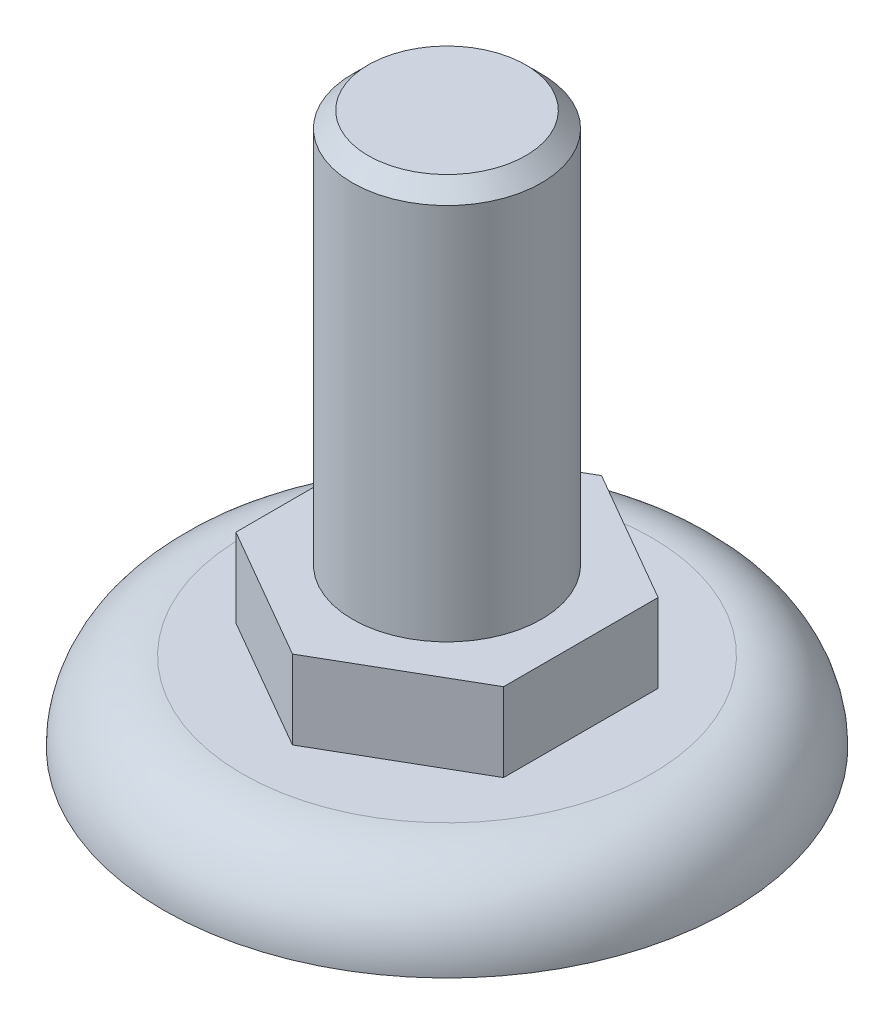
ISO-10303-21;
HEADER;
FILE_DESCRIPTION(('STEP AP214'),'2;1');
FILE_NAME('part.step','',(''),(''),'','','');
FILE_SCHEMA(('AUTOMOTIVE_DESIGN { 1 0 10303 214 1 1 1 1 }'));
ENDSEC;
DATA;
#1=APPLICATION_CONTEXT('core data for automotive mechanical design processes');
#2=APPLICATION_PROTOCOL_DEFINITION('international standard','automotive_design',2000,#1);
#3=PRODUCT_CONTEXT('',#1,'mechanical');
#4=PRODUCT('Part','Part','',(#3));
#5=PRODUCT_RELATED_PRODUCT_CATEGORY('part','',(#4));
#6=PRODUCT_DEFINITION_FORMATION('','',#4);
#7=PRODUCT_DEFINITION_CONTEXT('part definition',#1,'design');
#8=PRODUCT_DEFINITION('design','',#6,#7);
#9=PRODUCT_DEFINITION_SHAPE('','',#8);
#10=(LENGTH_UNIT() NAMED_UNIT(*) SI_UNIT(.MILLI.,.METRE.));
#11=(NAMED_UNIT(*) PLANE_ANGLE_UNIT() SI_UNIT($,.RADIAN.));
#12=(NAMED_UNIT(*) SI_UNIT($,.STERADIAN.) SOLID_ANGLE_UNIT());
#13=UNCERTAINTY_MEASURE_WITH_UNIT(LENGTH_MEASURE(1.E-05),#10,'distance_accuracy_value','');
#14=(GEOMETRIC_REPRESENTATION_CONTEXT(3) GLOBAL_UNCERTAINTY_ASSIGNED_CONTEXT((#13)) GLOBAL_UNIT_ASSIGNED_CONTEXT((#10,
#11,#12)) REPRESENTATION_CONTEXT('',''));
#15=CARTESIAN_POINT('',(0.,0.,0.));
#16=DIRECTION('',(0.,0.,1.));
#17=DIRECTION('',(1.,0.,0.));
#18=AXIS2_PLACEMENT_3D('',#15,#16,#17);
#19=CARTESIAN_POINT('',(-20.,70.,0.));
#20=DIRECTION('',(0.,-1.,0.));
#21=DIRECTION('',(0.,0.,-1.));
#22=AXIS2_PLACEMENT_3D('',#19,#20,#21);
#23=CYLINDRICAL_SURFACE('',#22,6.);
#24=CARTESIAN_POINT('',(-20.,69.,0.));
#25=DIRECTION('',(0.,1.,0.));
#26=DIRECTION('',(0.,0.,1.));
#27=AXIS2_PLACEMENT_3D('',#24,#25,#26);
#28=CIRCLE('',#27,6.);
#29=CARTESIAN_POINT('',(-20.,69.,6.));
#30=VERTEX_POINT('',#29);
#31=EDGE_CURVE('E25',#30,#30,#28,.F.);
#32=ORIENTED_EDGE('',*,*,#31,.T.);
#33=EDGE_LOOP('',(#32));
#34=FACE_BOUND('',#33,.T.);
#35=CARTESIAN_POINT('',(-20.,45.,0.));
#36=DIRECTION('',(0.,1.,0.));
#37=DIRECTION('',(0.,0.,1.));
#38=AXIS2_PLACEMENT_3D('',#35,#36,#37);
#39=CIRCLE('',#38,6.);
#40=CARTESIAN_POINT('',(-20.,45.,6.));
#41=VERTEX_POINT('',#40);
#42=EDGE_CURVE('E102',#41,#41,#39,.T.);
#43=ORIENTED_EDGE('',*,*,#42,.T.);
#44=EDGE_LOOP('',(#43));
#45=FACE_BOUND('',#44,.T.);
#46=ADVANCED_FACE('F15',(#34,#45),#23,.T.);
#47=CARTESIAN_POINT('',(-20.,70.,0.));
#48=DIRECTION('',(0.,1.,0.));
#49=DIRECTION('',(0.,0.,1.));
#50=AXIS2_PLACEMENT_3D('',#47,#48,#49);
#51=PLANE('',#50);
#52=CARTESIAN_POINT('',(-20.,70.,0.));
#53=DIRECTION('',(0.,1.,0.));
#54=DIRECTION('',(0.,0.,1.));
#55=AXIS2_PLACEMENT_3D('',#52,#53,#54);
#56=CIRCLE('',#55,5.);
#57=CARTESIAN_POINT('',(-20.,70.,5.));
#58=VERTEX_POINT('',#57);
#59=EDGE_CURVE('E105',#58,#58,#56,.T.);
#60=ORIENTED_EDGE('',*,*,#59,.T.);
#61=EDGE_LOOP('',(#60));
#62=FACE_BOUND('',#61,.T.);
#63=ADVANCED_FACE('F116',(#62),#51,.T.);
#64=CARTESIAN_POINT('',(-20.,70.,0.));
#65=DIRECTION('',(0.,-1.,0.));
#66=DIRECTION('',(0.,0.,-1.));
#67=AXIS2_PLACEMENT_3D('',#64,#65,#66);
#68=CONICAL_SURFACE('',#67,5.,0.785398163397446);
#69=ORIENTED_EDGE('',*,*,#31,.F.);
#70=EDGE_LOOP('',(#69));
#71=FACE_BOUND('',#70,.T.);
#72=ORIENTED_EDGE('',*,*,#59,.F.);
#73=EDGE_LOOP('',(#72));
#74=FACE_BOUND('',#73,.T.);
#75=ADVANCED_FACE('F17',(#71,#74),#68,.T.);
#76=CARTESIAN_POINT('',(-11.5,45.,-4.90747728811182));
#77=DIRECTION('',(-0.5,0.,0.866025403784439));
#78=DIRECTION('',(0.866025403784439,0.,0.5));
#79=AXIS2_PLACEMENT_3D('',#76,#77,#78);
#80=PLANE('',#79);
#81=DIRECTION('',(-0.866025403784439,0.,-0.5));
#82=VECTOR('',#81,1.);
#83=CARTESIAN_POINT('',(-11.5,40.,-4.90747728811182));
#84=LINE('',#83,#82);
#85=CARTESIAN_POINT('',(-11.5,40.,-4.90747728811182));
#86=VERTEX_POINT('',#85);
#87=CARTESIAN_POINT('',(-20.,40.,-9.81495457622364));
#88=VERTEX_POINT('',#87);
#89=EDGE_CURVE('E71',#86,#88,#84,.T.);
#90=ORIENTED_EDGE('',*,*,#89,.T.);
#91=DIRECTION('',(0.,-1.,0.));
#92=VECTOR('',#91,1.);
#93=CARTESIAN_POINT('',(-20.,45.,-9.81495457622364));
#94=LINE('',#93,#92);
#95=CARTESIAN_POINT('',(-20.,45.,-9.81495457622364));
#96=VERTEX_POINT('',#95);
#97=EDGE_CURVE('E99',#96,#88,#94,.T.);
#98=ORIENTED_EDGE('',*,*,#97,.F.);
#99=DIRECTION('',(-0.866025403784439,0.,-0.5));
#100=VECTOR('',#99,1.);
#101=CARTESIAN_POINT('',(-11.5,45.,-4.90747728811182));
#102=LINE('',#101,#100);
#103=CARTESIAN_POINT('',(-11.5,45.,-4.90747728811182));
#104=VERTEX_POINT('',#103);
#105=EDGE_CURVE('E75',#104,#96,#102,.T.);
#106=ORIENTED_EDGE('',*,*,#105,.F.);
#107=DIRECTION('',(0.,-1.,0.));
#108=VECTOR('',#107,1.);
#109=CARTESIAN_POINT('',(-11.5,45.,-4.90747728811182));
#110=LINE('',#109,#108);
#111=EDGE_CURVE('E88',#104,#86,#110,.T.);
#112=ORIENTED_EDGE('',*,*,#111,.T.);
#113=EDGE_LOOP('',(#90,#98,#106,#112));
#114=FACE_BOUND('',#113,.T.);
#115=ADVANCED_FACE('F115',(#114),#80,.F.);
#116=CARTESIAN_POINT('',(-20.,45.,-9.81495457622364));
#117=DIRECTION('',(0.5,0.,0.866025403784439));
#118=DIRECTION('',(0.866025403784439,0.,-0.5));
#119=AXIS2_PLACEMENT_3D('',#116,#117,#118);
#120=PLANE('',#119);
#121=DIRECTION('',(-0.866025403784439,0.,0.5));
#122=VECTOR('',#121,1.);
#123=CARTESIAN_POINT('',(-20.,40.,-9.81495457622364));
#124=LINE('',#123,#122);
#125=CARTESIAN_POINT('',(-28.5,40.,-4.90747728811182));
#126=VERTEX_POINT('',#125);
#127=EDGE_CURVE('E208',#88,#126,#124,.T.);
#128=ORIENTED_EDGE('',*,*,#127,.T.);
#129=DIRECTION('',(0.,-1.,0.));
#130=VECTOR('',#129,1.);
#131=CARTESIAN_POINT('',(-28.5,45.,-4.90747728811182));
#132=LINE('',#131,#130);
#133=CARTESIAN_POINT('',(-28.5,45.,-4.90747728811182));
#134=VERTEX_POINT('',#133);
#135=EDGE_CURVE('E96',#134,#126,#132,.T.);
#136=ORIENTED_EDGE('',*,*,#135,.F.);
#137=DIRECTION('',(-0.866025403784439,0.,0.5));
#138=VECTOR('',#137,1.);
#139=CARTESIAN_POINT('',(-20.,45.,-9.81495457622364));
#140=LINE('',#139,#138);
#141=EDGE_CURVE('E198',#96,#134,#140,.T.);
#142=ORIENTED_EDGE('',*,*,#141,.F.);
#143=ORIENTED_EDGE('',*,*,#97,.T.);
#144=EDGE_LOOP('',(#128,#136,#142,#143));
#145=FACE_BOUND('',#144,.T.);
#146=ADVANCED_FACE('F129',(#145),#120,.F.);
#147=CARTESIAN_POINT('',(-28.5,45.,-4.90747728811182));
#148=DIRECTION('',(1.,0.,0.));
#149=DIRECTION('',(0.,0.,-1.));
#150=AXIS2_PLACEMENT_3D('',#147,#148,#149);
#151=PLANE('',#150);
#152=DIRECTION('',(0.,0.,1.));
#153=VECTOR('',#152,1.);
#154=CARTESIAN_POINT('',(-28.5,40.,-4.90747728811182));
#155=LINE('',#154,#153);
#156=CARTESIAN_POINT('',(-28.5,40.,4.90747728811182));
#157=VERTEX_POINT('',#156);
#158=EDGE_CURVE('E211',#126,#157,#155,.T.);
#159=ORIENTED_EDGE('',*,*,#158,.T.);
#160=DIRECTION('',(0.,-1.,0.));
#161=VECTOR('',#160,1.);
#162=CARTESIAN_POINT('',(-28.5,45.,4.90747728811182));
#163=LINE('',#162,#161);
#164=CARTESIAN_POINT('',(-28.5,45.,4.90747728811182));
#165=VERTEX_POINT('',#164);
#166=EDGE_CURVE('E90',#165,#157,#163,.T.);
#167=ORIENTED_EDGE('',*,*,#166,.F.);
#168=DIRECTION('',(0.,0.,1.));
#169=VECTOR('',#168,1.);
#170=CARTESIAN_POINT('',(-28.5,45.,-4.90747728811182));
#171=LINE('',#170,#169);
#172=EDGE_CURVE('E200',#134,#165,#171,.T.);
#173=ORIENTED_EDGE('',*,*,#172,.F.);
#174=ORIENTED_EDGE('',*,*,#135,.T.);
#175=EDGE_LOOP('',(#159,#167,#173,#174));
#176=FACE_BOUND('',#175,.T.);
#177=ADVANCED_FACE('F133',(#176),#151,.F.);
#178=CARTESIAN_POINT('',(-28.5,45.,4.90747728811182));
#179=DIRECTION('',(0.5,0.,-0.866025403784439));
#180=DIRECTION('',(-0.866025403784439,0.,-0.5));
#181=AXIS2_PLACEMENT_3D('',#178,#179,#180);
#182=PLANE('',#181);
#183=DIRECTION('',(0.866025403784439,0.,0.5));
#184=VECTOR('',#183,1.);
#185=CARTESIAN_POINT('',(-28.5,40.,4.90747728811182));
#186=LINE('',#185,#184);
#187=CARTESIAN_POINT('',(-20.,40.,9.81495457622364));
#188=VERTEX_POINT('',#187);
#189=EDGE_CURVE('E85',#157,#188,#186,.T.);
#190=ORIENTED_EDGE('',*,*,#189,.T.);
#191=DIRECTION('',(0.,-1.,0.));
#192=VECTOR('',#191,1.);
#193=CARTESIAN_POINT('',(-20.,45.,9.81495457622364));
#194=LINE('',#193,#192);
#195=CARTESIAN_POINT('',(-20.,45.,9.81495457622364));
#196=VERTEX_POINT('',#195);
#197=EDGE_CURVE('E84',#196,#188,#194,.T.);
#198=ORIENTED_EDGE('',*,*,#197,.F.);
#199=DIRECTION('',(0.866025403784439,0.,0.5));
#200=VECTOR('',#199,1.);
#201=CARTESIAN_POINT('',(-28.5,45.,4.90747728811182));
#202=LINE('',#201,#200);
#203=EDGE_CURVE('E202',#165,#196,#202,.T.);
#204=ORIENTED_EDGE('',*,*,#203,.F.);
#205=ORIENTED_EDGE('',*,*,#166,.T.);
#206=EDGE_LOOP('',(#190,#198,#204,#205));
#207=FACE_BOUND('',#206,.T.);
#208=ADVANCED_FACE('F137',(#207),#182,.F.);
#209=CARTESIAN_POINT('',(-20.,45.,9.81495457622364));
#210=DIRECTION('',(-0.5,0.,-0.866025403784439));
#211=DIRECTION('',(-0.866025403784439,0.,0.5));
#212=AXIS2_PLACEMENT_3D('',#209,#210,#211);
#213=PLANE('',#212);
#214=DIRECTION('',(0.866025403784439,0.,-0.5));
#215=VECTOR('',#214,1.);
#216=CARTESIAN_POINT('',(-20.,40.,9.81495457622364));
#217=LINE('',#216,#215);
#218=CARTESIAN_POINT('',(-11.5,40.,4.90747728811182));
#219=VERTEX_POINT('',#218);
#220=EDGE_CURVE('E68',#188,#219,#217,.T.);
#221=ORIENTED_EDGE('',*,*,#220,.T.);
#222=DIRECTION('',(0.,-1.,0.));
#223=VECTOR('',#222,1.);
#224=CARTESIAN_POINT('',(-11.5,45.,4.90747728811182));
#225=LINE('',#224,#223);
#226=CARTESIAN_POINT('',(-11.5,45.,4.90747728811182));
#227=VERTEX_POINT('',#226);
#228=EDGE_CURVE('E82',#227,#219,#225,.T.);
#229=ORIENTED_EDGE('',*,*,#228,.F.);
#230=DIRECTION('',(0.866025403784439,0.,-0.5));
#231=VECTOR('',#230,1.);
#232=CARTESIAN_POINT('',(-20.,45.,9.81495457622364));
#233=LINE('',#232,#231);
#234=EDGE_CURVE('E204',#196,#227,#233,.T.);
#235=ORIENTED_EDGE('',*,*,#234,.F.);
#236=ORIENTED_EDGE('',*,*,#197,.T.);
#237=EDGE_LOOP('',(#221,#229,#235,#236));
#238=FACE_BOUND('',#237,.T.);
#239=ADVANCED_FACE('F80',(#238),#213,.F.);
#240=CARTESIAN_POINT('',(-11.5,45.,4.90747728811182));
#241=DIRECTION('',(-1.,0.,0.));
#242=DIRECTION('',(0.,0.,1.));
#243=AXIS2_PLACEMENT_3D('',#240,#241,#242);
#244=PLANE('',#243);
#245=DIRECTION('',(0.,0.,-1.));
#246=VECTOR('',#245,1.);
#247=CARTESIAN_POINT('',(-11.5,40.,4.90747728811182));
#248=LINE('',#247,#246);
#249=EDGE_CURVE('E65',#219,#86,#248,.T.);
#250=ORIENTED_EDGE('',*,*,#249,.T.);
#251=ORIENTED_EDGE('',*,*,#111,.F.);
#252=DIRECTION('',(0.,0.,-1.));
#253=VECTOR('',#252,1.);
#254=CARTESIAN_POINT('',(-11.5,45.,4.90747728811182));
#255=LINE('',#254,#253);
#256=EDGE_CURVE('E32',#227,#104,#255,.T.);
#257=ORIENTED_EDGE('',*,*,#256,.F.);
#258=ORIENTED_EDGE('',*,*,#228,.T.);
#259=EDGE_LOOP('',(#250,#251,#257,#258));
#260=FACE_BOUND('',#259,.T.);
#261=ADVANCED_FACE('F87',(#260),#244,.F.);
#262=CARTESIAN_POINT('',(0.,45.,0.));
#263=DIRECTION('',(0.,1.,0.));
#264=DIRECTION('',(0.,0.,1.));
#265=AXIS2_PLACEMENT_3D('',#262,#263,#264);
#266=PLANE('',#265);
#267=ORIENTED_EDGE('',*,*,#42,.F.);
#268=EDGE_LOOP('',(#267));
#269=FACE_BOUND('',#268,.T.);
#270=ORIENTED_EDGE('',*,*,#105,.T.);
#271=ORIENTED_EDGE('',*,*,#141,.T.);
#272=ORIENTED_EDGE('',*,*,#172,.T.);
#273=ORIENTED_EDGE('',*,*,#203,.T.);
#274=ORIENTED_EDGE('',*,*,#234,.T.);
#275=ORIENTED_EDGE('',*,*,#256,.T.);
#276=EDGE_LOOP('',(#270,#271,#272,#273,#274,#275));
#277=FACE_BOUND('',#276,.T.);
#278=ADVANCED_FACE('F146',(#269,#277),#266,.T.);
#279=CARTESIAN_POINT('',(-20.,40.,0.));
#280=DIRECTION('',(0.,1.,0.));
#281=DIRECTION('',(0.,0.,1.));
#282=AXIS2_PLACEMENT_3D('',#279,#280,#281);
#283=PLANE('',#282);
#284=CARTESIAN_POINT('',(-20.,40.,0.));
#285=DIRECTION('',(0.,1.,0.));
#286=DIRECTION('',(0.,0.,1.));
#287=AXIS2_PLACEMENT_3D('',#284,#285,#286);
#288=CIRCLE('',#287,13.);
#289=CARTESIAN_POINT('',(-20.,40.,13.));
#290=VERTEX_POINT('',#289);
#291=EDGE_CURVE('E194',#290,#290,#288,.T.);
#292=ORIENTED_EDGE('',*,*,#291,.T.);
#293=EDGE_LOOP('',(#292));
#294=FACE_BOUND('',#293,.T.);
#295=ORIENTED_EDGE('',*,*,#89,.F.);
#296=ORIENTED_EDGE('',*,*,#249,.F.);
#297=ORIENTED_EDGE('',*,*,#220,.F.);
#298=ORIENTED_EDGE('',*,*,#189,.F.);
#299=ORIENTED_EDGE('',*,*,#158,.F.);
#300=ORIENTED_EDGE('',*,*,#127,.F.);
#301=EDGE_LOOP('',(#295,#296,#297,#298,#299,#300));
#302=FACE_BOUND('',#301,.T.);
#303=ADVANCED_FACE('F67',(#294,#302),#283,.T.);
#304=CARTESIAN_POINT('',(-20.,35.,0.));
#305=DIRECTION('',(0.,1.,0.));
#306=DIRECTION('',(0.,0.,1.));
#307=AXIS2_PLACEMENT_3D('',#304,#305,#306);
#308=PLANE('',#307);
#309=CARTESIAN_POINT('',(-20.,35.,0.));
#310=DIRECTION('',(0.,1.,0.));
#311=DIRECTION('',(0.,0.,1.));
#312=AXIS2_PLACEMENT_3D('',#309,#310,#311);
#313=CIRCLE('',#312,5.);
#314=CARTESIAN_POINT('',(-20.,35.,5.));
#315=VERTEX_POINT('',#314);
#316=EDGE_CURVE('E10',#315,#315,#313,.F.);
#317=ORIENTED_EDGE('',*,*,#316,.F.);
#318=EDGE_LOOP('',(#317));
#319=FACE_BOUND('',#318,.T.);
#320=CARTESIAN_POINT('',(-20.,35.,0.));
#321=DIRECTION('',(0.,1.,0.));
#322=DIRECTION('',(0.,0.,1.));
#323=AXIS2_PLACEMENT_3D('',#320,#321,#322);
#324=CIRCLE('',#323,18.);
#325=CARTESIAN_POINT('',(-20.,35.,18.));
#326=VERTEX_POINT('',#325);
#327=EDGE_CURVE('E189',#326,#326,#324,.F.);
#328=ORIENTED_EDGE('',*,*,#327,.T.);
#329=EDGE_LOOP('',(#328));
#330=FACE_BOUND('',#329,.T.);
#331=ADVANCED_FACE('F154',(#319,#330),#308,.F.);
#332=CARTESIAN_POINT('',(-20.,35.,0.));
#333=DIRECTION('',(0.,1.,0.));
#334=DIRECTION('',(0.,0.,1.));
#335=AXIS2_PLACEMENT_3D('',#332,#333,#334);
#336=TOROIDAL_SURFACE('',#335,13.,5.);
#337=ORIENTED_EDGE('',*,*,#327,.F.);
#338=EDGE_LOOP('',(#337));
#339=FACE_BOUND('',#338,.T.);
#340=ORIENTED_EDGE('',*,*,#291,.F.);
#341=EDGE_LOOP('',(#340));
#342=FACE_BOUND('',#341,.T.);
#343=ADVANCED_FACE('F150',(#339,#342),#336,.T.);
#344=CARTESIAN_POINT('',(-20.,32.,0.));
#345=DIRECTION('',(0.,1.,0.));
#346=DIRECTION('',(0.,0.,1.));
#347=AXIS2_PLACEMENT_3D('',#344,#345,#346);
#348=CYLINDRICAL_SURFACE('',#347,5.);
#349=CARTESIAN_POINT('',(-20.,33.5,0.));
#350=DIRECTION('',(0.,1.,0.));
#351=DIRECTION('',(0.,0.,1.));
#352=AXIS2_PLACEMENT_3D('',#349,#350,#351);
#353=CIRCLE('',#352,5.);
#354=CARTESIAN_POINT('',(-20.,33.5,5.));
#355=VERTEX_POINT('',#354);
#356=EDGE_CURVE('E19',#355,#355,#353,.T.);
#357=ORIENTED_EDGE('',*,*,#356,.T.);
#358=EDGE_LOOP('',(#357));
#359=FACE_BOUND('',#358,.T.);
#360=ORIENTED_EDGE('',*,*,#316,.T.);
#361=EDGE_LOOP('',(#360));
#362=FACE_BOUND('',#361,.T.);
#363=ADVANCED_FACE('F153',(#359,#362),#348,.T.);
#364=CARTESIAN_POINT('',(-20.,33.5,0.));
#365=DIRECTION('',(0.,1.,0.));
#366=DIRECTION('',(0.,0.,1.));
#367=AXIS2_PLACEMENT_3D('',#364,#365,#366);
#368=PLANE('',#367);
#369=ORIENTED_EDGE('',*,*,#356,.F.);
#370=EDGE_LOOP('',(#369));
#371=FACE_BOUND('',#370,.T.);
#372=CARTESIAN_POINT('',(-20.,33.5,0.));
#373=DIRECTION('',(0.,1.,0.));
#374=DIRECTION('',(0.,0.,1.));
#375=AXIS2_PLACEMENT_3D('',#372,#373,#374);
#376=CIRCLE('',#375,7.5);
#377=CARTESIAN_POINT('',(-20.,33.5,7.5));
#378=VERTEX_POINT('',#377);
#379=EDGE_CURVE('E185',#378,#378,#376,.F.);
#380=ORIENTED_EDGE('',*,*,#379,.F.);
#381=EDGE_LOOP('',(#380));
#382=FACE_BOUND('',#381,.T.);
#383=ADVANCED_FACE('F164',(#371,#382),#368,.T.);
#384=CARTESIAN_POINT('',(-20.,54.7132034355964,0.));
#385=DIRECTION('',(0.,-1.,0.));
#386=DIRECTION('',(0.,0.,-1.));
#387=AXIS2_PLACEMENT_3D('',#384,#385,#386);
#388=CYLINDRICAL_SURFACE('',#387,7.5);
#389=CARTESIAN_POINT('',(-20.,32.,0.));
#390=DIRECTION('',(0.,-1.,0.));
#391=DIRECTION('',(0.,0.,-1.));
#392=AXIS2_PLACEMENT_3D('',#389,#390,#391);
#393=CIRCLE('',#392,7.5);
#394=CARTESIAN_POINT('',(-20.,32.,-7.5));
#395=VERTEX_POINT('',#394);
#396=EDGE_CURVE('E182',#395,#395,#393,.T.);
#397=ORIENTED_EDGE('',*,*,#396,.F.);
#398=EDGE_LOOP('',(#397));
#399=FACE_BOUND('',#398,.T.);
#400=ORIENTED_EDGE('',*,*,#379,.T.);
#401=EDGE_LOOP('',(#400));
#402=FACE_BOUND('',#401,.T.);
#403=ADVANCED_FACE('F169',(#399,#402),#388,.T.);
#404=CARTESIAN_POINT('',(-20.,32.,0.));
#405=DIRECTION('',(0.,-1.,0.));
#406=DIRECTION('',(0.,0.,-1.));
#407=AXIS2_PLACEMENT_3D('',#404,#405,#406);
#408=PLANE('',#407);
#409=ORIENTED_EDGE('',*,*,#396,.T.);
#410=EDGE_LOOP('',(#409));
#411=FACE_BOUND('',#410,.T.);
#412=ADVANCED_FACE('F166',(#411),#408,.T.);
#413=CLOSED_SHELL('',(#46,#63,#75,#115,#146,#177,#208,#239,#261,#278,#303,#331,#343,#363,#383,
#403,#412));
#414=MANIFOLD_SOLID_BREP('B1',#413);
#415=ADVANCED_BREP_SHAPE_REPRESENTATION('',(#18,#414),#14);
#416=SHAPE_DEFINITION_REPRESENTATION(#9,#415);
ENDSEC;
END-ISO-10303-21;
